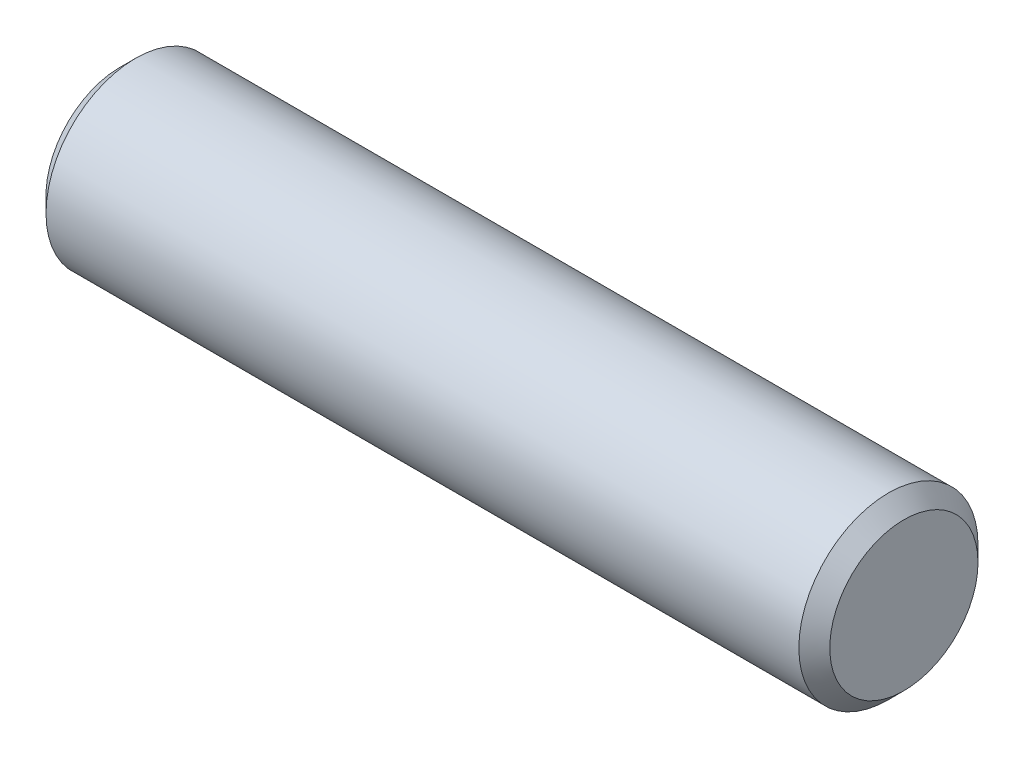
ISO-10303-21;
HEADER;
FILE_DESCRIPTION(('STEP AP214'),'2;1');
FILE_NAME('part.step','',(''),(''),'','','');
FILE_SCHEMA(('AUTOMOTIVE_DESIGN { 1 0 10303 214 1 1 1 1 }'));
ENDSEC;
DATA;
#1=APPLICATION_CONTEXT('core data for automotive mechanical design processes');
#2=APPLICATION_PROTOCOL_DEFINITION('international standard','automotive_design',2000,#1);
#3=PRODUCT_CONTEXT('',#1,'mechanical');
#4=PRODUCT('Part','Part','',(#3));
#5=PRODUCT_RELATED_PRODUCT_CATEGORY('part','',(#4));
#6=PRODUCT_DEFINITION_FORMATION('','',#4);
#7=PRODUCT_DEFINITION_CONTEXT('part definition',#1,'design');
#8=PRODUCT_DEFINITION('design','',#6,#7);
#9=PRODUCT_DEFINITION_SHAPE('','',#8);
#10=(LENGTH_UNIT() NAMED_UNIT(*) SI_UNIT(.MILLI.,.METRE.));
#11=(NAMED_UNIT(*) PLANE_ANGLE_UNIT() SI_UNIT($,.RADIAN.));
#12=(NAMED_UNIT(*) SI_UNIT($,.STERADIAN.) SOLID_ANGLE_UNIT());
#13=UNCERTAINTY_MEASURE_WITH_UNIT(LENGTH_MEASURE(1.E-05),#10,'distance_accuracy_value','');
#14=(GEOMETRIC_REPRESENTATION_CONTEXT(3) GLOBAL_UNCERTAINTY_ASSIGNED_CONTEXT((#13)) GLOBAL_UNIT_ASSIGNED_CONTEXT((#10,
#11,#12)) REPRESENTATION_CONTEXT('',''));
#15=CARTESIAN_POINT('',(0.,0.,0.));
#16=DIRECTION('',(0.,0.,1.));
#17=DIRECTION('',(1.,0.,0.));
#18=AXIS2_PLACEMENT_3D('',#15,#16,#17);
#19=CARTESIAN_POINT('',(0.,4.,0.));
#20=DIRECTION('',(1.,0.,0.));
#21=DIRECTION('',(0.,0.,-1.));
#22=AXIS2_PLACEMENT_3D('',#19,#20,#21);
#23=PLANE('',#22);
#24=CARTESIAN_POINT('',(0.,0.,0.));
#25=DIRECTION('',(1.,0.,0.));
#26=DIRECTION('',(0.,0.,-1.));
#27=AXIS2_PLACEMENT_3D('',#24,#25,#26);
#28=CIRCLE('',#27,3.3095);
#29=CARTESIAN_POINT('',(0.,0.,-3.3095));
#30=VERTEX_POINT('',#29);
#31=EDGE_CURVE('E52',#30,#30,#28,.F.);
#32=ORIENTED_EDGE('',*,*,#31,.T.);
#33=EDGE_LOOP('',(#32));
#34=FACE_BOUND('',#33,.T.);
#35=ADVANCED_FACE('F37',(#34),#23,.F.);
#36=CARTESIAN_POINT('',(-3.175,0.,0.));
#37=DIRECTION('',(-1.,0.,0.));
#38=DIRECTION('',(0.,0.,1.));
#39=AXIS2_PLACEMENT_3D('',#36,#37,#38);
#40=CYLINDRICAL_SURFACE('',#39,4.);
#41=CARTESIAN_POINT('',(0.690500000000003,0.,0.));
#42=DIRECTION('',(1.,0.,0.));
#43=DIRECTION('',(0.,0.,-1.));
#44=AXIS2_PLACEMENT_3D('',#41,#42,#43);
#45=CIRCLE('',#44,4.);
#46=CARTESIAN_POINT('',(0.690500000000003,0.,-4.));
#47=VERTEX_POINT('',#46);
#48=EDGE_CURVE('E44',#47,#47,#45,.T.);
#49=ORIENTED_EDGE('',*,*,#48,.T.);
#50=EDGE_LOOP('',(#49));
#51=FACE_BOUND('',#50,.T.);
#52=CARTESIAN_POINT('',(34.3095,0.,0.));
#53=DIRECTION('',(1.,0.,0.));
#54=DIRECTION('',(0.,0.,-1.));
#55=AXIS2_PLACEMENT_3D('',#52,#53,#54);
#56=CIRCLE('',#55,4.);
#57=CARTESIAN_POINT('',(34.3095,0.,-4.));
#58=VERTEX_POINT('',#57);
#59=EDGE_CURVE('E48',#58,#58,#56,.F.);
#60=ORIENTED_EDGE('',*,*,#59,.T.);
#61=EDGE_LOOP('',(#60));
#62=FACE_BOUND('',#61,.T.);
#63=ADVANCED_FACE('F68',(#51,#62),#40,.T.);
#64=CARTESIAN_POINT('',(35.,4.,0.));
#65=DIRECTION('',(1.,0.,0.));
#66=DIRECTION('',(0.,0.,-1.));
#67=AXIS2_PLACEMENT_3D('',#64,#65,#66);
#68=PLANE('',#67);
#69=CARTESIAN_POINT('',(35.,0.,0.));
#70=DIRECTION('',(1.,0.,0.));
#71=DIRECTION('',(0.,0.,-1.));
#72=AXIS2_PLACEMENT_3D('',#69,#70,#71);
#73=CIRCLE('',#72,3.3095);
#74=CARTESIAN_POINT('',(35.,0.,-3.3095));
#75=VERTEX_POINT('',#74);
#76=EDGE_CURVE('E10',#75,#75,#73,.T.);
#77=ORIENTED_EDGE('',*,*,#76,.T.);
#78=EDGE_LOOP('',(#77));
#79=FACE_BOUND('',#78,.T.);
#80=ADVANCED_FACE('F61',(#79),#68,.T.);
#81=CARTESIAN_POINT('',(0.,0.,0.));
#82=DIRECTION('',(1.,0.,0.));
#83=DIRECTION('',(0.,0.,-1.));
#84=AXIS2_PLACEMENT_3D('',#81,#82,#83);
#85=CONICAL_SURFACE('',#84,3.3095,0.785398163397446);
#86=ORIENTED_EDGE('',*,*,#48,.F.);
#87=EDGE_LOOP('',(#86));
#88=FACE_BOUND('',#87,.T.);
#89=ORIENTED_EDGE('',*,*,#31,.F.);
#90=EDGE_LOOP('',(#89));
#91=FACE_BOUND('',#90,.T.);
#92=ADVANCED_FACE('F59',(#88,#91),#85,.T.);
#93=CARTESIAN_POINT('',(34.3095,0.,0.));
#94=DIRECTION('',(-1.,0.,0.));
#95=DIRECTION('',(0.,0.,1.));
#96=AXIS2_PLACEMENT_3D('',#93,#94,#95);
#97=CONICAL_SURFACE('',#96,4.,0.785398163397442);
#98=ORIENTED_EDGE('',*,*,#76,.F.);
#99=EDGE_LOOP('',(#98));
#100=FACE_BOUND('',#99,.T.);
#101=ORIENTED_EDGE('',*,*,#59,.F.);
#102=EDGE_LOOP('',(#101));
#103=FACE_BOUND('',#102,.T.);
#104=ADVANCED_FACE('F39',(#100,#103),#97,.T.);
#105=CLOSED_SHELL('',(#35,#63,#80,#92,#104));
#106=MANIFOLD_SOLID_BREP('B2',#105);
#107=ADVANCED_BREP_SHAPE_REPRESENTATION('',(#18,#106),#14);
#108=SHAPE_DEFINITION_REPRESENTATION(#9,#107);
ENDSEC;
END-ISO-10303-21;
